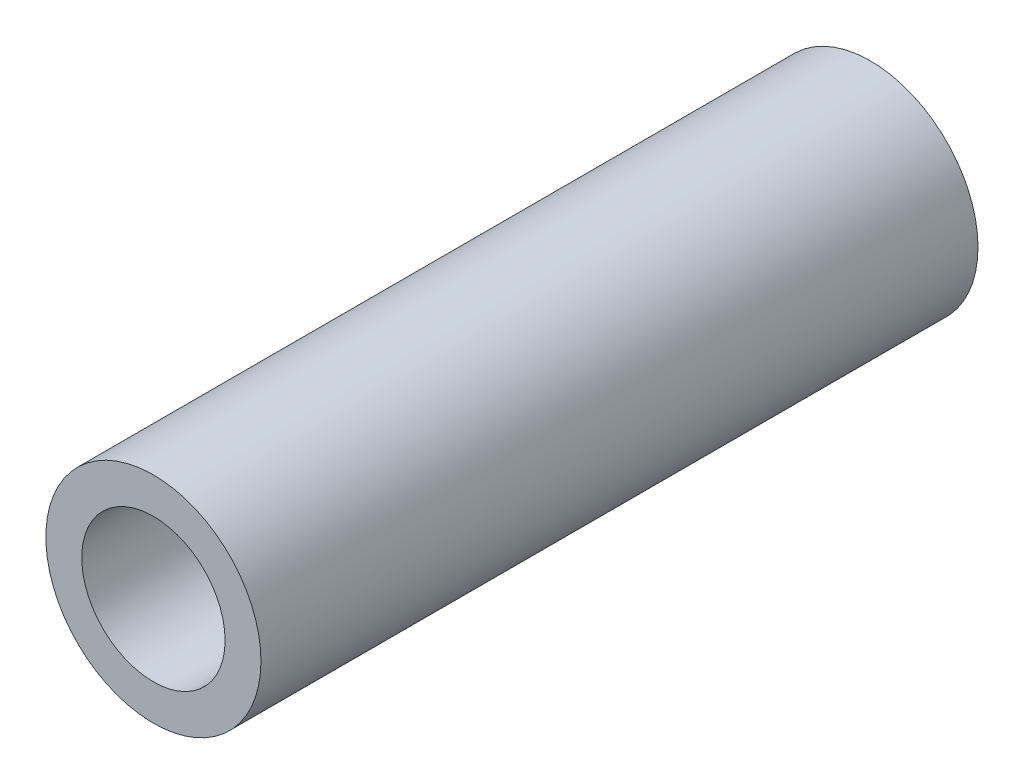
ISO-10303-21;
HEADER;
FILE_DESCRIPTION(('STEP AP214'),'2;1');
FILE_NAME('part.step','',(''),(''),'','','');
FILE_SCHEMA(('AUTOMOTIVE_DESIGN { 1 0 10303 214 1 1 1 1 }'));
ENDSEC;
DATA;
#1=APPLICATION_CONTEXT('core data for automotive mechanical design processes');
#2=APPLICATION_PROTOCOL_DEFINITION('international standard','automotive_design',2000,#1);
#3=PRODUCT_CONTEXT('',#1,'mechanical');
#4=PRODUCT('Part','Part','',(#3));
#5=PRODUCT_RELATED_PRODUCT_CATEGORY('part','',(#4));
#6=PRODUCT_DEFINITION_FORMATION('','',#4);
#7=PRODUCT_DEFINITION_CONTEXT('part definition',#1,'design');
#8=PRODUCT_DEFINITION('design','',#6,#7);
#9=PRODUCT_DEFINITION_SHAPE('','',#8);
#10=(LENGTH_UNIT() NAMED_UNIT(*) SI_UNIT(.MILLI.,.METRE.));
#11=(NAMED_UNIT(*) PLANE_ANGLE_UNIT() SI_UNIT($,.RADIAN.));
#12=(NAMED_UNIT(*) SI_UNIT($,.STERADIAN.) SOLID_ANGLE_UNIT());
#13=UNCERTAINTY_MEASURE_WITH_UNIT(LENGTH_MEASURE(1.E-05),#10,'distance_accuracy_value','');
#14=(GEOMETRIC_REPRESENTATION_CONTEXT(3) GLOBAL_UNCERTAINTY_ASSIGNED_CONTEXT((#13)) GLOBAL_UNIT_ASSIGNED_CONTEXT((#10,
#11,#12)) REPRESENTATION_CONTEXT('',''));
#15=CARTESIAN_POINT('',(0.,0.,0.));
#16=DIRECTION('',(0.,0.,1.));
#17=DIRECTION('',(1.,0.,0.));
#18=AXIS2_PLACEMENT_3D('',#15,#16,#17);
#19=CARTESIAN_POINT('',(0.,0.,-30.));
#20=DIRECTION('',(0.,0.,1.));
#21=DIRECTION('',(1.,0.,0.));
#22=AXIS2_PLACEMENT_3D('',#19,#20,#21);
#23=CYLINDRICAL_SURFACE('',#22,9.);
#24=CARTESIAN_POINT('',(0.,0.,-30.));
#25=DIRECTION('',(0.,0.,1.));
#26=DIRECTION('',(1.,0.,0.));
#27=AXIS2_PLACEMENT_3D('',#24,#25,#26);
#28=CIRCLE('',#27,9.);
#29=CARTESIAN_POINT('',(9.,0.,-30.));
#30=VERTEX_POINT('',#29);
#31=EDGE_CURVE('E11',#30,#30,#28,.T.);
#32=ORIENTED_EDGE('',*,*,#31,.T.);
#33=EDGE_LOOP('',(#32));
#34=FACE_BOUND('',#33,.T.);
#35=CARTESIAN_POINT('',(0.,0.,30.));
#36=DIRECTION('',(0.,0.,1.));
#37=DIRECTION('',(1.,0.,0.));
#38=AXIS2_PLACEMENT_3D('',#35,#36,#37);
#39=CIRCLE('',#38,9.);
#40=CARTESIAN_POINT('',(9.,0.,30.));
#41=VERTEX_POINT('',#40);
#42=EDGE_CURVE('E62',#41,#41,#39,.T.);
#43=ORIENTED_EDGE('',*,*,#42,.F.);
#44=EDGE_LOOP('',(#43));
#45=FACE_BOUND('',#44,.T.);
#46=ADVANCED_FACE('F51',(#34,#45),#23,.T.);
#47=CARTESIAN_POINT('',(0.,0.,-30.));
#48=DIRECTION('',(0.,0.,1.));
#49=DIRECTION('',(1.,0.,0.));
#50=AXIS2_PLACEMENT_3D('',#47,#48,#49);
#51=PLANE('',#50);
#52=CARTESIAN_POINT('',(0.,0.,-30.));
#53=DIRECTION('',(0.,0.,1.));
#54=DIRECTION('',(1.,0.,0.));
#55=AXIS2_PLACEMENT_3D('',#52,#53,#54);
#56=CIRCLE('',#55,6.);
#57=CARTESIAN_POINT('',(6.,0.,-30.));
#58=VERTEX_POINT('',#57);
#59=EDGE_CURVE('E60',#58,#58,#56,.T.);
#60=ORIENTED_EDGE('',*,*,#59,.T.);
#61=EDGE_LOOP('',(#60));
#62=FACE_BOUND('',#61,.T.);
#63=ORIENTED_EDGE('',*,*,#31,.F.);
#64=EDGE_LOOP('',(#63));
#65=FACE_BOUND('',#64,.T.);
#66=ADVANCED_FACE('F78',(#62,#65),#51,.F.);
#67=CARTESIAN_POINT('',(0.,0.,-30.));
#68=DIRECTION('',(0.,0.,1.));
#69=DIRECTION('',(1.,0.,0.));
#70=AXIS2_PLACEMENT_3D('',#67,#68,#69);
#71=CYLINDRICAL_SURFACE('',#70,6.);
#72=ORIENTED_EDGE('',*,*,#59,.F.);
#73=EDGE_LOOP('',(#72));
#74=FACE_BOUND('',#73,.T.);
#75=CARTESIAN_POINT('',(0.,0.,30.));
#76=DIRECTION('',(0.,0.,1.));
#77=DIRECTION('',(1.,0.,0.));
#78=AXIS2_PLACEMENT_3D('',#75,#76,#77);
#79=CIRCLE('',#78,6.);
#80=CARTESIAN_POINT('',(6.,0.,30.));
#81=VERTEX_POINT('',#80);
#82=EDGE_CURVE('E63',#81,#81,#79,.T.);
#83=ORIENTED_EDGE('',*,*,#82,.T.);
#84=EDGE_LOOP('',(#83));
#85=FACE_BOUND('',#84,.T.);
#86=ADVANCED_FACE('F73',(#74,#85),#71,.F.);
#87=CARTESIAN_POINT('',(0.,0.,30.));
#88=DIRECTION('',(0.,0.,1.));
#89=DIRECTION('',(1.,0.,0.));
#90=AXIS2_PLACEMENT_3D('',#87,#88,#89);
#91=PLANE('',#90);
#92=ORIENTED_EDGE('',*,*,#42,.T.);
#93=EDGE_LOOP('',(#92));
#94=FACE_BOUND('',#93,.T.);
#95=ORIENTED_EDGE('',*,*,#82,.F.);
#96=EDGE_LOOP('',(#95));
#97=FACE_BOUND('',#96,.T.);
#98=ADVANCED_FACE('F71',(#94,#97),#91,.T.);
#99=CLOSED_SHELL('',(#46,#66,#86,#98));
#100=MANIFOLD_SOLID_BREP('B2',#99);
#101=ADVANCED_BREP_SHAPE_REPRESENTATION('',(#18,#100),#14);
#102=SHAPE_DEFINITION_REPRESENTATION(#9,#101);
ENDSEC;
END-ISO-10303-21;
